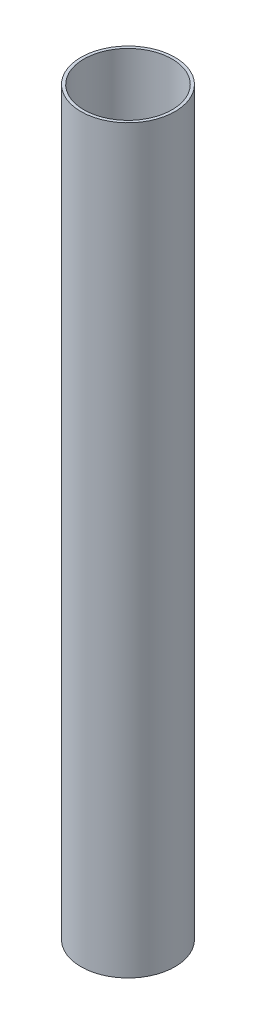
ISO-10303-21;
HEADER;
FILE_DESCRIPTION(('STEP AP214'),'2;1');
FILE_NAME('part.step','',(''),(''),'','','');
FILE_SCHEMA(('AUTOMOTIVE_DESIGN { 1 0 10303 214 1 1 1 1 }'));
ENDSEC;
DATA;
#1=APPLICATION_CONTEXT('core data for automotive mechanical design processes');
#2=APPLICATION_PROTOCOL_DEFINITION('international standard','automotive_design',2000,#1);
#3=PRODUCT_CONTEXT('',#1,'mechanical');
#4=PRODUCT('Part','Part','',(#3));
#5=PRODUCT_RELATED_PRODUCT_CATEGORY('part','',(#4));
#6=PRODUCT_DEFINITION_FORMATION('','',#4);
#7=PRODUCT_DEFINITION_CONTEXT('part definition',#1,'design');
#8=PRODUCT_DEFINITION('design','',#6,#7);
#9=PRODUCT_DEFINITION_SHAPE('','',#8);
#10=(LENGTH_UNIT() NAMED_UNIT(*) SI_UNIT(.MILLI.,.METRE.));
#11=(NAMED_UNIT(*) PLANE_ANGLE_UNIT() SI_UNIT($,.RADIAN.));
#12=(NAMED_UNIT(*) SI_UNIT($,.STERADIAN.) SOLID_ANGLE_UNIT());
#13=UNCERTAINTY_MEASURE_WITH_UNIT(LENGTH_MEASURE(1.E-05),#10,'distance_accuracy_value','');
#14=(GEOMETRIC_REPRESENTATION_CONTEXT(3) GLOBAL_UNCERTAINTY_ASSIGNED_CONTEXT((#13)) GLOBAL_UNIT_ASSIGNED_CONTEXT((#10,
#11,#12)) REPRESENTATION_CONTEXT('',''));
#15=CARTESIAN_POINT('',(0.,0.,0.));
#16=DIRECTION('',(0.,0.,1.));
#17=DIRECTION('',(1.,0.,0.));
#18=AXIS2_PLACEMENT_3D('',#15,#16,#17);
#19=CARTESIAN_POINT('',(0.,500.,0.));
#20=DIRECTION('',(0.,1.,0.));
#21=DIRECTION('',(0.,0.,1.));
#22=AXIS2_PLACEMENT_3D('',#19,#20,#21);
#23=PLANE('',#22);
#24=CARTESIAN_POINT('',(0.,500.,0.));
#25=DIRECTION('',(0.,1.,0.));
#26=DIRECTION('',(0.,0.,1.));
#27=AXIS2_PLACEMENT_3D('',#24,#25,#26);
#28=CIRCLE('',#27,31.75);
#29=CARTESIAN_POINT('',(0.,500.,31.75));
#30=VERTEX_POINT('',#29);
#31=EDGE_CURVE('E10',#30,#30,#28,.T.);
#32=ORIENTED_EDGE('',*,*,#31,.T.);
#33=EDGE_LOOP('',(#32));
#34=FACE_BOUND('',#33,.T.);
#35=CARTESIAN_POINT('',(0.,500.,0.));
#36=DIRECTION('',(0.,1.,0.));
#37=DIRECTION('',(0.,0.,1.));
#38=AXIS2_PLACEMENT_3D('',#35,#36,#37);
#39=CIRCLE('',#38,29.75);
#40=CARTESIAN_POINT('',(0.,500.,29.75));
#41=VERTEX_POINT('',#40);
#42=EDGE_CURVE('E47',#41,#41,#39,.T.);
#43=ORIENTED_EDGE('',*,*,#42,.F.);
#44=EDGE_LOOP('',(#43));
#45=FACE_BOUND('',#44,.T.);
#46=ADVANCED_FACE('F36',(#34,#45),#23,.T.);
#47=CARTESIAN_POINT('',(0.,0.,0.));
#48=DIRECTION('',(0.,1.,0.));
#49=DIRECTION('',(0.,0.,1.));
#50=AXIS2_PLACEMENT_3D('',#47,#48,#49);
#51=PLANE('',#50);
#52=CARTESIAN_POINT('',(0.,0.,0.));
#53=DIRECTION('',(0.,1.,0.));
#54=DIRECTION('',(0.,0.,1.));
#55=AXIS2_PLACEMENT_3D('',#52,#53,#54);
#56=CIRCLE('',#55,31.75);
#57=CARTESIAN_POINT('',(0.,0.,31.75));
#58=VERTEX_POINT('',#57);
#59=EDGE_CURVE('E40',#58,#58,#56,.T.);
#60=ORIENTED_EDGE('',*,*,#59,.F.);
#61=EDGE_LOOP('',(#60));
#62=FACE_BOUND('',#61,.T.);
#63=CARTESIAN_POINT('',(0.,0.,0.));
#64=DIRECTION('',(0.,1.,0.));
#65=DIRECTION('',(0.,0.,1.));
#66=AXIS2_PLACEMENT_3D('',#63,#64,#65);
#67=CIRCLE('',#66,29.75);
#68=CARTESIAN_POINT('',(0.,0.,29.75));
#69=VERTEX_POINT('',#68);
#70=EDGE_CURVE('E49',#69,#69,#67,.T.);
#71=ORIENTED_EDGE('',*,*,#70,.T.);
#72=EDGE_LOOP('',(#71));
#73=FACE_BOUND('',#72,.T.);
#74=ADVANCED_FACE('F59',(#62,#73),#51,.F.);
#75=CARTESIAN_POINT('',(0.,500.,0.));
#76=DIRECTION('',(0.,-1.,0.));
#77=DIRECTION('',(0.,0.,-1.));
#78=AXIS2_PLACEMENT_3D('',#75,#76,#77);
#79=CYLINDRICAL_SURFACE('',#78,31.75);
#80=ORIENTED_EDGE('',*,*,#31,.F.);
#81=EDGE_LOOP('',(#80));
#82=FACE_BOUND('',#81,.T.);
#83=ORIENTED_EDGE('',*,*,#59,.T.);
#84=EDGE_LOOP('',(#83));
#85=FACE_BOUND('',#84,.T.);
#86=ADVANCED_FACE('F38',(#82,#85),#79,.T.);
#87=CARTESIAN_POINT('',(0.,500.,0.));
#88=DIRECTION('',(0.,-1.,0.));
#89=DIRECTION('',(0.,0.,-1.));
#90=AXIS2_PLACEMENT_3D('',#87,#88,#89);
#91=CYLINDRICAL_SURFACE('',#90,29.75);
#92=ORIENTED_EDGE('',*,*,#42,.T.);
#93=EDGE_LOOP('',(#92));
#94=FACE_BOUND('',#93,.T.);
#95=ORIENTED_EDGE('',*,*,#70,.F.);
#96=EDGE_LOOP('',(#95));
#97=FACE_BOUND('',#96,.T.);
#98=ADVANCED_FACE('F55',(#94,#97),#91,.F.);
#99=CLOSED_SHELL('',(#46,#74,#86,#98));
#100=MANIFOLD_SOLID_BREP('B2',#99);
#101=ADVANCED_BREP_SHAPE_REPRESENTATION('',(#18,#100),#14);
#102=SHAPE_DEFINITION_REPRESENTATION(#9,#101);
ENDSEC;
END-ISO-10303-21;
